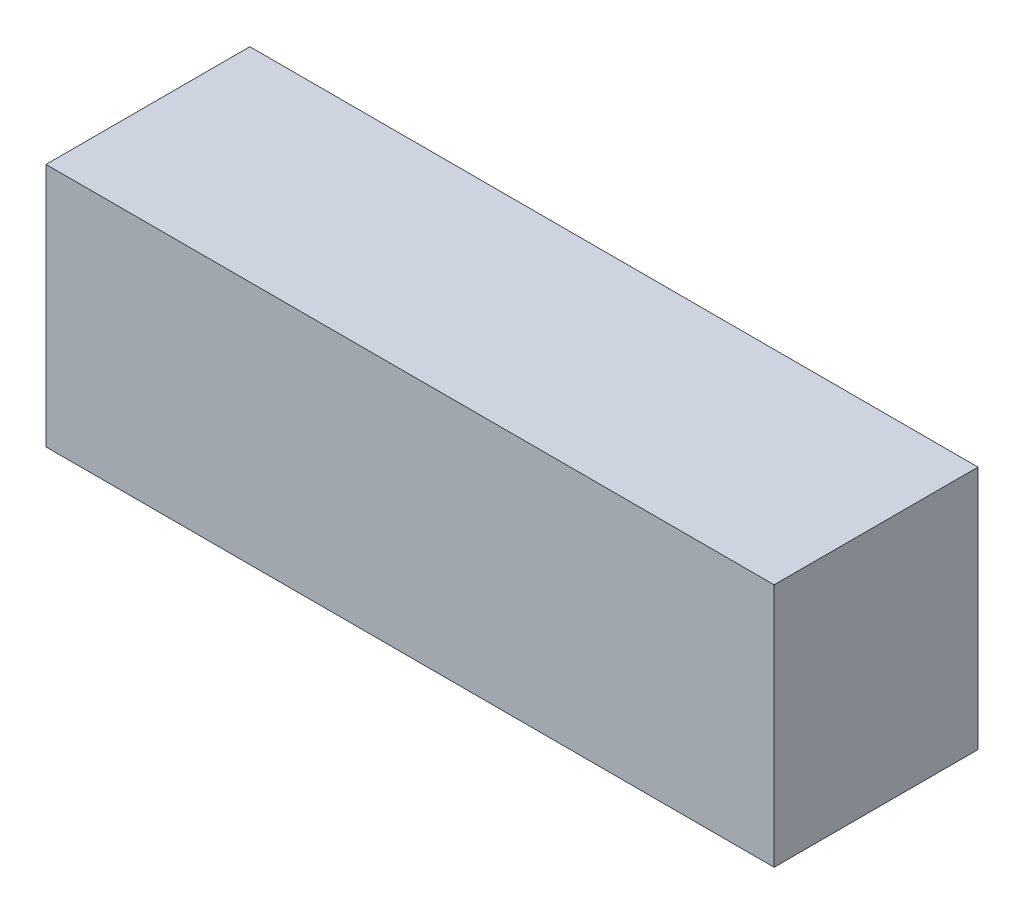
ISO-10303-21;
HEADER;
FILE_DESCRIPTION(('STEP AP214'),'2;1');
FILE_NAME('part.step','',(''),(''),'','','');
FILE_SCHEMA(('AUTOMOTIVE_DESIGN { 1 0 10303 214 1 1 1 1 }'));
ENDSEC;
DATA;
#1=APPLICATION_CONTEXT('core data for automotive mechanical design processes');
#2=APPLICATION_PROTOCOL_DEFINITION('international standard','automotive_design',2000,#1);
#3=PRODUCT_CONTEXT('',#1,'mechanical');
#4=PRODUCT('Part','Part','',(#3));
#5=PRODUCT_RELATED_PRODUCT_CATEGORY('part','',(#4));
#6=PRODUCT_DEFINITION_FORMATION('','',#4);
#7=PRODUCT_DEFINITION_CONTEXT('part definition',#1,'design');
#8=PRODUCT_DEFINITION('design','',#6,#7);
#9=PRODUCT_DEFINITION_SHAPE('','',#8);
#10=(LENGTH_UNIT() NAMED_UNIT(*) SI_UNIT(.MILLI.,.METRE.));
#11=(NAMED_UNIT(*) PLANE_ANGLE_UNIT() SI_UNIT($,.RADIAN.));
#12=(NAMED_UNIT(*) SI_UNIT($,.STERADIAN.) SOLID_ANGLE_UNIT());
#13=UNCERTAINTY_MEASURE_WITH_UNIT(LENGTH_MEASURE(1.E-05),#10,'distance_accuracy_value','');
#14=(GEOMETRIC_REPRESENTATION_CONTEXT(3) GLOBAL_UNCERTAINTY_ASSIGNED_CONTEXT((#13)) GLOBAL_UNIT_ASSIGNED_CONTEXT((#10,
#11,#12)) REPRESENTATION_CONTEXT('',''));
#15=CARTESIAN_POINT('',(0.,0.,0.));
#16=DIRECTION('',(0.,0.,1.));
#17=DIRECTION('',(1.,0.,0.));
#18=AXIS2_PLACEMENT_3D('',#15,#16,#17);
#19=CARTESIAN_POINT('',(0.,0.,35.));
#20=DIRECTION('',(-1.,0.,0.));
#21=DIRECTION('',(0.,0.,1.));
#22=AXIS2_PLACEMENT_3D('',#19,#20,#21);
#23=PLANE('',#22);
#24=DIRECTION('',(0.,1.,0.));
#25=VECTOR('',#24,1.);
#26=CARTESIAN_POINT('',(0.,0.,0.));
#27=LINE('',#26,#25);
#28=CARTESIAN_POINT('',(0.,0.,0.));
#29=VERTEX_POINT('',#28);
#30=CARTESIAN_POINT('',(0.,42.,0.));
#31=VERTEX_POINT('',#30);
#32=EDGE_CURVE('E97',#29,#31,#27,.T.);
#33=ORIENTED_EDGE('',*,*,#32,.T.);
#34=DIRECTION('',(0.,0.,-1.));
#35=VECTOR('',#34,1.);
#36=CARTESIAN_POINT('',(0.,42.,35.));
#37=LINE('',#36,#35);
#38=CARTESIAN_POINT('',(0.,42.,35.));
#39=VERTEX_POINT('',#38);
#40=EDGE_CURVE('E11',#39,#31,#37,.T.);
#41=ORIENTED_EDGE('',*,*,#40,.F.);
#42=DIRECTION('',(0.,1.,0.));
#43=VECTOR('',#42,1.);
#44=CARTESIAN_POINT('',(0.,0.,35.));
#45=LINE('',#44,#43);
#46=CARTESIAN_POINT('',(0.,0.,35.));
#47=VERTEX_POINT('',#46);
#48=EDGE_CURVE('E85',#47,#39,#45,.T.);
#49=ORIENTED_EDGE('',*,*,#48,.F.);
#50=DIRECTION('',(0.,0.,-1.));
#51=VECTOR('',#50,1.);
#52=CARTESIAN_POINT('',(0.,0.,35.));
#53=LINE('',#52,#51);
#54=EDGE_CURVE('E93',#47,#29,#53,.T.);
#55=ORIENTED_EDGE('',*,*,#54,.T.);
#56=EDGE_LOOP('',(#33,#41,#49,#55));
#57=FACE_BOUND('',#56,.T.);
#58=ADVANCED_FACE('F34',(#57),#23,.F.);
#59=CARTESIAN_POINT('',(0.,42.,35.));
#60=DIRECTION('',(0.,-1.,0.));
#61=DIRECTION('',(1.,0.,0.));
#62=AXIS2_PLACEMENT_3D('',#59,#60,#61);
#63=PLANE('',#62);
#64=DIRECTION('',(-1.,0.,0.));
#65=VECTOR('',#64,1.);
#66=CARTESIAN_POINT('',(0.,42.,0.));
#67=LINE('',#66,#65);
#68=CARTESIAN_POINT('',(-125.,42.,0.));
#69=VERTEX_POINT('',#68);
#70=EDGE_CURVE('E89',#31,#69,#67,.T.);
#71=ORIENTED_EDGE('',*,*,#70,.T.);
#72=DIRECTION('',(0.,0.,-1.));
#73=VECTOR('',#72,1.);
#74=CARTESIAN_POINT('',(-125.,42.,35.));
#75=LINE('',#74,#73);
#76=CARTESIAN_POINT('',(-125.,42.,35.));
#77=VERTEX_POINT('',#76);
#78=EDGE_CURVE('E42',#77,#69,#75,.T.);
#79=ORIENTED_EDGE('',*,*,#78,.F.);
#80=DIRECTION('',(-1.,0.,0.));
#81=VECTOR('',#80,1.);
#82=CARTESIAN_POINT('',(0.,42.,35.));
#83=LINE('',#82,#81);
#84=EDGE_CURVE('E80',#39,#77,#83,.T.);
#85=ORIENTED_EDGE('',*,*,#84,.F.);
#86=ORIENTED_EDGE('',*,*,#40,.T.);
#87=EDGE_LOOP('',(#71,#79,#85,#86));
#88=FACE_BOUND('',#87,.T.);
#89=ADVANCED_FACE('F88',(#88),#63,.F.);
#90=CARTESIAN_POINT('',(-125.,0.,35.));
#91=DIRECTION('',(1.,0.,0.));
#92=DIRECTION('',(0.,0.,-1.));
#93=AXIS2_PLACEMENT_3D('',#90,#91,#92);
#94=PLANE('',#93);
#95=DIRECTION('',(0.,-1.,0.));
#96=VECTOR('',#95,1.);
#97=CARTESIAN_POINT('',(-125.,0.,0.));
#98=LINE('',#97,#96);
#99=CARTESIAN_POINT('',(-125.,0.,0.));
#100=VERTEX_POINT('',#99);
#101=EDGE_CURVE('E67',#69,#100,#98,.T.);
#102=ORIENTED_EDGE('',*,*,#101,.T.);
#103=DIRECTION('',(0.,0.,-1.));
#104=VECTOR('',#103,1.);
#105=CARTESIAN_POINT('',(-125.,0.,35.));
#106=LINE('',#105,#104);
#107=CARTESIAN_POINT('',(-125.,0.,35.));
#108=VERTEX_POINT('',#107);
#109=EDGE_CURVE('E90',#108,#100,#106,.T.);
#110=ORIENTED_EDGE('',*,*,#109,.F.);
#111=DIRECTION('',(0.,-1.,0.));
#112=VECTOR('',#111,1.);
#113=CARTESIAN_POINT('',(-125.,0.,35.));
#114=LINE('',#113,#112);
#115=EDGE_CURVE('E83',#77,#108,#114,.T.);
#116=ORIENTED_EDGE('',*,*,#115,.F.);
#117=ORIENTED_EDGE('',*,*,#78,.T.);
#118=EDGE_LOOP('',(#102,#110,#116,#117));
#119=FACE_BOUND('',#118,.T.);
#120=ADVANCED_FACE('F91',(#119),#94,.F.);
#121=CARTESIAN_POINT('',(0.,0.,35.));
#122=DIRECTION('',(0.,1.,0.));
#123=DIRECTION('',(-1.,0.,0.));
#124=AXIS2_PLACEMENT_3D('',#121,#122,#123);
#125=PLANE('',#124);
#126=DIRECTION('',(1.,0.,0.));
#127=VECTOR('',#126,1.);
#128=CARTESIAN_POINT('',(0.,0.,0.));
#129=LINE('',#128,#127);
#130=EDGE_CURVE('E73',#100,#29,#129,.T.);
#131=ORIENTED_EDGE('',*,*,#130,.T.);
#132=ORIENTED_EDGE('',*,*,#54,.F.);
#133=DIRECTION('',(1.,0.,0.));
#134=VECTOR('',#133,1.);
#135=CARTESIAN_POINT('',(0.,0.,35.));
#136=LINE('',#135,#134);
#137=EDGE_CURVE('E50',#108,#47,#136,.T.);
#138=ORIENTED_EDGE('',*,*,#137,.F.);
#139=ORIENTED_EDGE('',*,*,#109,.T.);
#140=EDGE_LOOP('',(#131,#132,#138,#139));
#141=FACE_BOUND('',#140,.T.);
#142=ADVANCED_FACE('F104',(#141),#125,.F.);
#143=CARTESIAN_POINT('',(0.,0.,35.));
#144=DIRECTION('',(0.,0.,1.));
#145=DIRECTION('',(1.,0.,0.));
#146=AXIS2_PLACEMENT_3D('',#143,#144,#145);
#147=PLANE('',#146);
#148=ORIENTED_EDGE('',*,*,#48,.T.);
#149=ORIENTED_EDGE('',*,*,#84,.T.);
#150=ORIENTED_EDGE('',*,*,#115,.T.);
#151=ORIENTED_EDGE('',*,*,#137,.T.);
#152=EDGE_LOOP('',(#148,#149,#150,#151));
#153=FACE_BOUND('',#152,.T.);
#154=ADVANCED_FACE('F81',(#153),#147,.T.);
#155=CARTESIAN_POINT('',(0.,0.,0.));
#156=DIRECTION('',(0.,0.,1.));
#157=DIRECTION('',(1.,0.,0.));
#158=AXIS2_PLACEMENT_3D('',#155,#156,#157);
#159=PLANE('',#158);
#160=ORIENTED_EDGE('',*,*,#32,.F.);
#161=ORIENTED_EDGE('',*,*,#130,.F.);
#162=ORIENTED_EDGE('',*,*,#101,.F.);
#163=ORIENTED_EDGE('',*,*,#70,.F.);
#164=EDGE_LOOP('',(#160,#161,#162,#163));
#165=FACE_BOUND('',#164,.T.);
#166=ADVANCED_FACE('F107',(#165),#159,.F.);
#167=CLOSED_SHELL('',(#58,#89,#120,#142,#154,#166));
#168=MANIFOLD_SOLID_BREP('B2',#167);
#169=ADVANCED_BREP_SHAPE_REPRESENTATION('',(#18,#168),#14);
#170=SHAPE_DEFINITION_REPRESENTATION(#9,#169);
ENDSEC;
END-ISO-10303-21;
